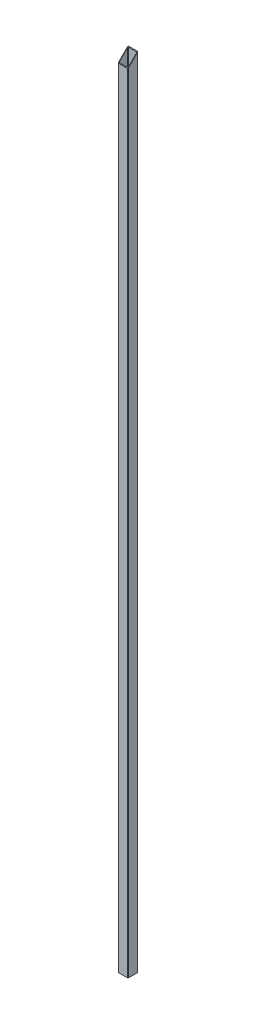
ISO-10303-21;
HEADER;
FILE_DESCRIPTION(('STEP AP214'),'2;1');
FILE_NAME('part.step','',(''),(''),'','','');
FILE_SCHEMA(('AUTOMOTIVE_DESIGN { 1 0 10303 214 1 1 1 1 }'));
ENDSEC;
DATA;
#1=APPLICATION_CONTEXT('core data for automotive mechanical design processes');
#2=APPLICATION_PROTOCOL_DEFINITION('international standard','automotive_design',2000,#1);
#3=PRODUCT_CONTEXT('',#1,'mechanical');
#4=PRODUCT('Part','Part','',(#3));
#5=PRODUCT_RELATED_PRODUCT_CATEGORY('part','',(#4));
#6=PRODUCT_DEFINITION_FORMATION('','',#4);
#7=PRODUCT_DEFINITION_CONTEXT('part definition',#1,'design');
#8=PRODUCT_DEFINITION('design','',#6,#7);
#9=PRODUCT_DEFINITION_SHAPE('','',#8);
#10=(LENGTH_UNIT() NAMED_UNIT(*) SI_UNIT(.MILLI.,.METRE.));
#11=(NAMED_UNIT(*) PLANE_ANGLE_UNIT() SI_UNIT($,.RADIAN.));
#12=(NAMED_UNIT(*) SI_UNIT($,.STERADIAN.) SOLID_ANGLE_UNIT());
#13=UNCERTAINTY_MEASURE_WITH_UNIT(LENGTH_MEASURE(1.E-05),#10,'distance_accuracy_value','');
#14=(GEOMETRIC_REPRESENTATION_CONTEXT(3) GLOBAL_UNCERTAINTY_ASSIGNED_CONTEXT((#13)) GLOBAL_UNIT_ASSIGNED_CONTEXT((#10,
#11,#12)) REPRESENTATION_CONTEXT('',''));
#15=CARTESIAN_POINT('',(0.,0.,0.));
#16=DIRECTION('',(0.,0.,1.));
#17=DIRECTION('',(1.,0.,0.));
#18=AXIS2_PLACEMENT_3D('',#15,#16,#17);
#19=CARTESIAN_POINT('',(18.,0.,18.));
#20=DIRECTION('',(0.,1.,0.));
#21=DIRECTION('',(0.,0.,1.));
#22=AXIS2_PLACEMENT_3D('',#19,#20,#21);
#23=PLANE('',#22);
#24=CARTESIAN_POINT('',(18.,0.,18.));
#25=DIRECTION('',(0.,1.,0.));
#26=DIRECTION('',(0.,0.,1.));
#27=AXIS2_PLACEMENT_3D('',#24,#25,#26);
#28=CIRCLE('',#27,2.);
#29=CARTESIAN_POINT('',(18.,0.,20.));
#30=VERTEX_POINT('',#29);
#31=CARTESIAN_POINT('',(20.,0.,18.));
#32=VERTEX_POINT('',#31);
#33=EDGE_CURVE('E196',#30,#32,#28,.T.);
#34=ORIENTED_EDGE('',*,*,#33,.F.);
#35=DIRECTION('',(1.,0.,0.));
#36=VECTOR('',#35,1.);
#37=CARTESIAN_POINT('',(-18.,0.,20.));
#38=LINE('',#37,#36);
#39=CARTESIAN_POINT('',(-18.,0.,20.));
#40=VERTEX_POINT('',#39);
#41=EDGE_CURVE('E157',#40,#30,#38,.T.);
#42=ORIENTED_EDGE('',*,*,#41,.F.);
#43=CARTESIAN_POINT('',(-18.,0.,18.));
#44=DIRECTION('',(0.,1.,0.));
#45=DIRECTION('',(0.,0.,1.));
#46=AXIS2_PLACEMENT_3D('',#43,#44,#45);
#47=CIRCLE('',#46,2.);
#48=CARTESIAN_POINT('',(-20.,0.,18.));
#49=VERTEX_POINT('',#48);
#50=EDGE_CURVE('E213',#49,#40,#47,.T.);
#51=ORIENTED_EDGE('',*,*,#50,.F.);
#52=DIRECTION('',(0.,0.,1.));
#53=VECTOR('',#52,1.);
#54=CARTESIAN_POINT('',(-20.,0.,-18.));
#55=LINE('',#54,#53);
#56=CARTESIAN_POINT('',(-20.,0.,-18.));
#57=VERTEX_POINT('',#56);
#58=EDGE_CURVE('E210',#57,#49,#55,.T.);
#59=ORIENTED_EDGE('',*,*,#58,.F.);
#60=CARTESIAN_POINT('',(-18.,0.,-18.));
#61=DIRECTION('',(0.,1.,0.));
#62=DIRECTION('',(0.,0.,1.));
#63=AXIS2_PLACEMENT_3D('',#60,#61,#62);
#64=CIRCLE('',#63,2.);
#65=CARTESIAN_POINT('',(-18.,0.,-20.));
#66=VERTEX_POINT('',#65);
#67=EDGE_CURVE('E208',#66,#57,#64,.T.);
#68=ORIENTED_EDGE('',*,*,#67,.F.);
#69=DIRECTION('',(-1.,0.,0.));
#70=VECTOR('',#69,1.);
#71=CARTESIAN_POINT('',(-18.,0.,-20.));
#72=LINE('',#71,#70);
#73=CARTESIAN_POINT('',(18.,0.,-20.));
#74=VERTEX_POINT('',#73);
#75=EDGE_CURVE('E170',#74,#66,#72,.T.);
#76=ORIENTED_EDGE('',*,*,#75,.F.);
#77=CARTESIAN_POINT('',(18.,0.,-18.));
#78=DIRECTION('',(0.,1.,0.));
#79=DIRECTION('',(0.,0.,-1.));
#80=AXIS2_PLACEMENT_3D('',#77,#78,#79);
#81=CIRCLE('',#80,2.);
#82=CARTESIAN_POINT('',(20.,0.,-18.));
#83=VERTEX_POINT('',#82);
#84=EDGE_CURVE('E197',#83,#74,#81,.T.);
#85=ORIENTED_EDGE('',*,*,#84,.F.);
#86=DIRECTION('',(0.,0.,-1.));
#87=VECTOR('',#86,1.);
#88=CARTESIAN_POINT('',(20.,0.,-18.));
#89=LINE('',#88,#87);
#90=EDGE_CURVE('E186',#32,#83,#89,.T.);
#91=ORIENTED_EDGE('',*,*,#90,.F.);
#92=EDGE_LOOP('',(#34,#42,#51,#59,#68,#76,#85,#91));
#93=FACE_BOUND('',#92,.T.);
#94=CARTESIAN_POINT('',(16.,0.,16.));
#95=DIRECTION('',(0.,1.,0.));
#96=DIRECTION('',(0.,0.,1.));
#97=AXIS2_PLACEMENT_3D('',#94,#95,#96);
#98=CIRCLE('',#97,2.);
#99=CARTESIAN_POINT('',(16.,0.,18.));
#100=VERTEX_POINT('',#99);
#101=CARTESIAN_POINT('',(18.,0.,16.));
#102=VERTEX_POINT('',#101);
#103=EDGE_CURVE('E252',#100,#102,#98,.T.);
#104=ORIENTED_EDGE('',*,*,#103,.T.);
#105=DIRECTION('',(0.,0.,-1.));
#106=VECTOR('',#105,1.);
#107=CARTESIAN_POINT('',(18.,0.,16.));
#108=LINE('',#107,#106);
#109=CARTESIAN_POINT('',(18.,0.,-16.));
#110=VERTEX_POINT('',#109);
#111=EDGE_CURVE('E255',#102,#110,#108,.T.);
#112=ORIENTED_EDGE('',*,*,#111,.T.);
#113=CARTESIAN_POINT('',(16.,0.,-16.));
#114=DIRECTION('',(0.,1.,0.));
#115=DIRECTION('',(0.,0.,1.));
#116=AXIS2_PLACEMENT_3D('',#113,#114,#115);
#117=CIRCLE('',#116,2.);
#118=CARTESIAN_POINT('',(16.,0.,-18.));
#119=VERTEX_POINT('',#118);
#120=EDGE_CURVE('E258',#110,#119,#117,.T.);
#121=ORIENTED_EDGE('',*,*,#120,.T.);
#122=DIRECTION('',(-1.,0.,0.));
#123=VECTOR('',#122,1.);
#124=CARTESIAN_POINT('',(16.,0.,-18.));
#125=LINE('',#124,#123);
#126=CARTESIAN_POINT('',(-16.,0.,-18.));
#127=VERTEX_POINT('',#126);
#128=EDGE_CURVE('E261',#119,#127,#125,.T.);
#129=ORIENTED_EDGE('',*,*,#128,.T.);
#130=CARTESIAN_POINT('',(-16.,0.,-16.));
#131=DIRECTION('',(0.,1.,0.));
#132=DIRECTION('',(0.,0.,1.));
#133=AXIS2_PLACEMENT_3D('',#130,#131,#132);
#134=CIRCLE('',#133,2.);
#135=CARTESIAN_POINT('',(-18.,0.,-16.));
#136=VERTEX_POINT('',#135);
#137=EDGE_CURVE('E264',#127,#136,#134,.T.);
#138=ORIENTED_EDGE('',*,*,#137,.T.);
#139=DIRECTION('',(0.,0.,1.));
#140=VECTOR('',#139,1.);
#141=CARTESIAN_POINT('',(-18.,0.,16.));
#142=LINE('',#141,#140);
#143=CARTESIAN_POINT('',(-18.,0.,16.));
#144=VERTEX_POINT('',#143);
#145=EDGE_CURVE('E267',#136,#144,#142,.T.);
#146=ORIENTED_EDGE('',*,*,#145,.T.);
#147=CARTESIAN_POINT('',(-16.,0.,16.));
#148=DIRECTION('',(0.,1.,0.));
#149=DIRECTION('',(0.,0.,-1.));
#150=AXIS2_PLACEMENT_3D('',#147,#148,#149);
#151=CIRCLE('',#150,2.);
#152=CARTESIAN_POINT('',(-16.,0.,18.));
#153=VERTEX_POINT('',#152);
#154=EDGE_CURVE('E270',#144,#153,#151,.T.);
#155=ORIENTED_EDGE('',*,*,#154,.T.);
#156=DIRECTION('',(1.,0.,0.));
#157=VECTOR('',#156,1.);
#158=CARTESIAN_POINT('',(16.,0.,18.));
#159=LINE('',#158,#157);
#160=EDGE_CURVE('E273',#153,#100,#159,.T.);
#161=ORIENTED_EDGE('',*,*,#160,.T.);
#162=EDGE_LOOP('',(#104,#112,#121,#129,#138,#146,#155,#161));
#163=FACE_BOUND('',#162,.T.);
#164=ADVANCED_FACE('F35',(#93,#163),#23,.F.);
#165=CARTESIAN_POINT('',(18.,3200.,18.));
#166=DIRECTION('',(0.,-1.,0.));
#167=DIRECTION('',(0.,0.,-1.));
#168=AXIS2_PLACEMENT_3D('',#165,#166,#167);
#169=CYLINDRICAL_SURFACE('',#168,2.);
#170=DIRECTION('',(0.,-1.,0.));
#171=VECTOR('',#170,1.);
#172=CARTESIAN_POINT('',(20.,3200.,18.));
#173=LINE('',#172,#171);
#174=CARTESIAN_POINT('',(20.,3162.,17.9999999999999));
#175=VERTEX_POINT('',#174);
#176=EDGE_CURVE('E43',#175,#32,#173,.T.);
#177=ORIENTED_EDGE('',*,*,#176,.F.);
#178=CARTESIAN_POINT('',(18.,3162.,18.));
#179=DIRECTION('',(0.,-0.707106781186543,-0.707106781186552));
#180=DIRECTION('',(0.,-0.707106781186552,0.707106781186543));
#181=AXIS2_PLACEMENT_3D('',#178,#179,#180);
#182=ELLIPSE('',#181,2.8284271247462,2.);
#183=CARTESIAN_POINT('',(18.,3160.,20.));
#184=VERTEX_POINT('',#183);
#185=EDGE_CURVE('E250',#175,#184,#182,.T.);
#186=ORIENTED_EDGE('',*,*,#185,.T.);
#187=DIRECTION('',(0.,-1.,0.));
#188=VECTOR('',#187,1.);
#189=CARTESIAN_POINT('',(18.,3200.,20.));
#190=LINE('',#189,#188);
#191=EDGE_CURVE('E156',#184,#30,#190,.T.);
#192=ORIENTED_EDGE('',*,*,#191,.T.);
#193=ORIENTED_EDGE('',*,*,#33,.T.);
#194=EDGE_LOOP('',(#177,#186,#192,#193));
#195=FACE_BOUND('',#194,.T.);
#196=ADVANCED_FACE('F37',(#195),#169,.T.);
#197=CARTESIAN_POINT('',(20.,3200.,-18.));
#198=DIRECTION('',(-1.,0.,0.));
#199=DIRECTION('',(0.,0.,1.));
#200=AXIS2_PLACEMENT_3D('',#197,#198,#199);
#201=PLANE('',#200);
#202=DIRECTION('',(0.,-1.,0.));
#203=VECTOR('',#202,1.);
#204=CARTESIAN_POINT('',(20.,3200.,-18.));
#205=LINE('',#204,#203);
#206=CARTESIAN_POINT('',(20.,3198.,-18.));
#207=VERTEX_POINT('',#206);
#208=EDGE_CURVE('E173',#207,#83,#205,.T.);
#209=ORIENTED_EDGE('',*,*,#208,.F.);
#210=DIRECTION('',(0.,0.707106781186552,-0.707106781186543));
#211=VECTOR('',#210,1.);
#212=CARTESIAN_POINT('',(20.,3160.,20.));
#213=LINE('',#212,#211);
#214=EDGE_CURVE('E188',#175,#207,#213,.T.);
#215=ORIENTED_EDGE('',*,*,#214,.F.);
#216=ORIENTED_EDGE('',*,*,#176,.T.);
#217=ORIENTED_EDGE('',*,*,#90,.T.);
#218=EDGE_LOOP('',(#209,#215,#216,#217));
#219=FACE_BOUND('',#218,.T.);
#220=ADVANCED_FACE('F185',(#219),#201,.F.);
#221=CARTESIAN_POINT('',(18.,3200.,-18.));
#222=DIRECTION('',(0.,-1.,0.));
#223=DIRECTION('',(0.,0.,-1.));
#224=AXIS2_PLACEMENT_3D('',#221,#222,#223);
#225=CYLINDRICAL_SURFACE('',#224,2.);
#226=DIRECTION('',(0.,-1.,0.));
#227=VECTOR('',#226,1.);
#228=CARTESIAN_POINT('',(18.,3200.,-20.));
#229=LINE('',#228,#227);
#230=CARTESIAN_POINT('',(18.,3200.,-20.));
#231=VERTEX_POINT('',#230);
#232=EDGE_CURVE('E171',#231,#74,#229,.T.);
#233=ORIENTED_EDGE('',*,*,#232,.F.);
#234=CARTESIAN_POINT('',(18.,3198.,-18.));
#235=DIRECTION('',(0.,-0.707106781186543,-0.707106781186552));
#236=DIRECTION('',(0.,-0.707106781186552,0.707106781186543));
#237=AXIS2_PLACEMENT_3D('',#234,#235,#236);
#238=ELLIPSE('',#237,2.82842712474621,2.);
#239=EDGE_CURVE('E151',#231,#207,#238,.T.);
#240=ORIENTED_EDGE('',*,*,#239,.T.);
#241=ORIENTED_EDGE('',*,*,#208,.T.);
#242=ORIENTED_EDGE('',*,*,#84,.T.);
#243=EDGE_LOOP('',(#233,#240,#241,#242));
#244=FACE_BOUND('',#243,.T.);
#245=ADVANCED_FACE('F353',(#244),#225,.T.);
#246=CARTESIAN_POINT('',(-18.,3200.,-20.));
#247=DIRECTION('',(0.,0.,1.));
#248=DIRECTION('',(1.,0.,0.));
#249=AXIS2_PLACEMENT_3D('',#246,#247,#248);
#250=PLANE('',#249);
#251=ORIENTED_EDGE('',*,*,#75,.T.);
#252=DIRECTION('',(0.,-1.,0.));
#253=VECTOR('',#252,1.);
#254=CARTESIAN_POINT('',(-18.,3200.,-20.));
#255=LINE('',#254,#253);
#256=CARTESIAN_POINT('',(-18.,3200.,-20.));
#257=VERTEX_POINT('',#256);
#258=EDGE_CURVE('E164',#257,#66,#255,.T.);
#259=ORIENTED_EDGE('',*,*,#258,.F.);
#260=DIRECTION('',(-1.,0.,0.));
#261=VECTOR('',#260,1.);
#262=CARTESIAN_POINT('',(-18.,3200.,-20.));
#263=LINE('',#262,#261);
#264=EDGE_CURVE('E145',#231,#257,#263,.T.);
#265=ORIENTED_EDGE('',*,*,#264,.F.);
#266=ORIENTED_EDGE('',*,*,#232,.T.);
#267=EDGE_LOOP('',(#251,#259,#265,#266));
#268=FACE_BOUND('',#267,.T.);
#269=ADVANCED_FACE('F168',(#268),#250,.F.);
#270=CARTESIAN_POINT('',(-18.,3200.,-18.));
#271=DIRECTION('',(0.,-1.,0.));
#272=DIRECTION('',(0.,0.,-1.));
#273=AXIS2_PLACEMENT_3D('',#270,#271,#272);
#274=CYLINDRICAL_SURFACE('',#273,2.);
#275=DIRECTION('',(0.,-1.,0.));
#276=VECTOR('',#275,1.);
#277=CARTESIAN_POINT('',(-20.,3200.,-18.));
#278=LINE('',#277,#276);
#279=CARTESIAN_POINT('',(-20.,3198.,-18.0000000000001));
#280=VERTEX_POINT('',#279);
#281=EDGE_CURVE('E166',#280,#57,#278,.T.);
#282=ORIENTED_EDGE('',*,*,#281,.F.);
#283=CARTESIAN_POINT('',(-18.,3198.,-18.));
#284=DIRECTION('',(0.,-0.707106781186543,-0.707106781186552));
#285=DIRECTION('',(0.,-0.707106781186552,0.707106781186543));
#286=AXIS2_PLACEMENT_3D('',#283,#284,#285);
#287=ELLIPSE('',#286,2.8284271247462,2.);
#288=EDGE_CURVE('E148',#280,#257,#287,.T.);
#289=ORIENTED_EDGE('',*,*,#288,.T.);
#290=ORIENTED_EDGE('',*,*,#258,.T.);
#291=ORIENTED_EDGE('',*,*,#67,.T.);
#292=EDGE_LOOP('',(#282,#289,#290,#291));
#293=FACE_BOUND('',#292,.T.);
#294=ADVANCED_FACE('F162',(#293),#274,.T.);
#295=CARTESIAN_POINT('',(-20.,3200.,-18.));
#296=DIRECTION('',(1.,0.,0.));
#297=DIRECTION('',(0.,0.,-1.));
#298=AXIS2_PLACEMENT_3D('',#295,#296,#297);
#299=PLANE('',#298);
#300=DIRECTION('',(0.,-1.,0.));
#301=VECTOR('',#300,1.);
#302=CARTESIAN_POINT('',(-20.,3200.,18.));
#303=LINE('',#302,#301);
#304=CARTESIAN_POINT('',(-20.,3162.,18.));
#305=VERTEX_POINT('',#304);
#306=EDGE_CURVE('E175',#305,#49,#303,.T.);
#307=ORIENTED_EDGE('',*,*,#306,.F.);
#308=DIRECTION('',(0.,0.707106781186552,-0.707106781186543));
#309=VECTOR('',#308,1.);
#310=CARTESIAN_POINT('',(-20.,3160.,20.));
#311=LINE('',#310,#309);
#312=EDGE_CURVE('E231',#305,#280,#311,.T.);
#313=ORIENTED_EDGE('',*,*,#312,.T.);
#314=ORIENTED_EDGE('',*,*,#281,.T.);
#315=ORIENTED_EDGE('',*,*,#58,.T.);
#316=EDGE_LOOP('',(#307,#313,#314,#315));
#317=FACE_BOUND('',#316,.T.);
#318=ADVANCED_FACE('F226',(#317),#299,.F.);
#319=CARTESIAN_POINT('',(-18.,3200.,18.));
#320=DIRECTION('',(0.,-1.,0.));
#321=DIRECTION('',(0.,0.,-1.));
#322=AXIS2_PLACEMENT_3D('',#319,#320,#321);
#323=CYLINDRICAL_SURFACE('',#322,2.);
#324=DIRECTION('',(0.,-1.,0.));
#325=VECTOR('',#324,1.);
#326=CARTESIAN_POINT('',(-18.,3200.,20.));
#327=LINE('',#326,#325);
#328=CARTESIAN_POINT('',(-18.,3160.,20.));
#329=VERTEX_POINT('',#328);
#330=EDGE_CURVE('E218',#329,#40,#327,.T.);
#331=ORIENTED_EDGE('',*,*,#330,.F.);
#332=CARTESIAN_POINT('',(-18.,3162.,18.));
#333=DIRECTION('',(0.,-0.707106781186543,-0.707106781186552));
#334=DIRECTION('',(0.,-0.707106781186552,0.707106781186543));
#335=AXIS2_PLACEMENT_3D('',#332,#333,#334);
#336=ELLIPSE('',#335,2.8284271247462,2.);
#337=EDGE_CURVE('E50',#329,#305,#336,.T.);
#338=ORIENTED_EDGE('',*,*,#337,.T.);
#339=ORIENTED_EDGE('',*,*,#306,.T.);
#340=ORIENTED_EDGE('',*,*,#50,.T.);
#341=EDGE_LOOP('',(#331,#338,#339,#340));
#342=FACE_BOUND('',#341,.T.);
#343=ADVANCED_FACE('F222',(#342),#323,.T.);
#344=CARTESIAN_POINT('',(-18.,3200.,20.));
#345=DIRECTION('',(0.,0.,-1.));
#346=DIRECTION('',(-1.,0.,0.));
#347=AXIS2_PLACEMENT_3D('',#344,#345,#346);
#348=PLANE('',#347);
#349=ORIENTED_EDGE('',*,*,#191,.F.);
#350=DIRECTION('',(1.,0.,0.));
#351=VECTOR('',#350,1.);
#352=CARTESIAN_POINT('',(-20.,3160.,20.));
#353=LINE('',#352,#351);
#354=EDGE_CURVE('E229',#329,#184,#353,.T.);
#355=ORIENTED_EDGE('',*,*,#354,.F.);
#356=ORIENTED_EDGE('',*,*,#330,.T.);
#357=ORIENTED_EDGE('',*,*,#41,.T.);
#358=EDGE_LOOP('',(#349,#355,#356,#357));
#359=FACE_BOUND('',#358,.T.);
#360=ADVANCED_FACE('F228',(#359),#348,.F.);
#361=CARTESIAN_POINT('',(16.,3200.,16.));
#362=DIRECTION('',(0.,-1.,0.));
#363=DIRECTION('',(0.,0.,-1.));
#364=AXIS2_PLACEMENT_3D('',#361,#362,#363);
#365=CYLINDRICAL_SURFACE('',#364,2.);
#366=CARTESIAN_POINT('',(16.,3164.,16.));
#367=DIRECTION('',(0.,-0.707106781186543,-0.707106781186552));
#368=DIRECTION('',(0.,-0.707106781186552,0.707106781186543));
#369=AXIS2_PLACEMENT_3D('',#366,#367,#368);
#370=ELLIPSE('',#369,2.8284271247462,2.);
#371=CARTESIAN_POINT('',(18.,3164.,16.));
#372=VERTEX_POINT('',#371);
#373=CARTESIAN_POINT('',(16.,3162.,18.));
#374=VERTEX_POINT('',#373);
#375=EDGE_CURVE('E57',#372,#374,#370,.T.);
#376=ORIENTED_EDGE('',*,*,#375,.F.);
#377=DIRECTION('',(0.,-1.,0.));
#378=VECTOR('',#377,1.);
#379=CARTESIAN_POINT('',(18.,3200.,16.));
#380=LINE('',#379,#378);
#381=EDGE_CURVE('E201',#372,#102,#380,.T.);
#382=ORIENTED_EDGE('',*,*,#381,.T.);
#383=ORIENTED_EDGE('',*,*,#103,.F.);
#384=DIRECTION('',(0.,-1.,0.));
#385=VECTOR('',#384,1.);
#386=CARTESIAN_POINT('',(16.,3200.,18.));
#387=LINE('',#386,#385);
#388=EDGE_CURVE('E276',#374,#100,#387,.T.);
#389=ORIENTED_EDGE('',*,*,#388,.F.);
#390=EDGE_LOOP('',(#376,#382,#383,#389));
#391=FACE_BOUND('',#390,.T.);
#392=ADVANCED_FACE('F304',(#391),#365,.F.);
#393=CARTESIAN_POINT('',(18.,3200.,16.));
#394=DIRECTION('',(-1.,0.,0.));
#395=DIRECTION('',(0.,0.,1.));
#396=AXIS2_PLACEMENT_3D('',#393,#394,#395);
#397=PLANE('',#396);
#398=DIRECTION('',(0.,-0.707106781186552,0.707106781186543));
#399=VECTOR('',#398,1.);
#400=CARTESIAN_POINT('',(18.,3182.,-2.00000000000022));
#401=LINE('',#400,#399);
#402=CARTESIAN_POINT('',(18.,3196.,-16.));
#403=VERTEX_POINT('',#402);
#404=EDGE_CURVE('E245',#403,#372,#401,.T.);
#405=ORIENTED_EDGE('',*,*,#404,.F.);
#406=DIRECTION('',(0.,-1.,0.));
#407=VECTOR('',#406,1.);
#408=CARTESIAN_POINT('',(18.,3200.,-16.));
#409=LINE('',#408,#407);
#410=EDGE_CURVE('E203',#403,#110,#409,.T.);
#411=ORIENTED_EDGE('',*,*,#410,.T.);
#412=ORIENTED_EDGE('',*,*,#111,.F.);
#413=ORIENTED_EDGE('',*,*,#381,.F.);
#414=EDGE_LOOP('',(#405,#411,#412,#413));
#415=FACE_BOUND('',#414,.T.);
#416=ADVANCED_FACE('F293',(#415),#397,.T.);
#417=CARTESIAN_POINT('',(16.,3200.,-16.));
#418=DIRECTION('',(0.,-1.,0.));
#419=DIRECTION('',(0.,0.,-1.));
#420=AXIS2_PLACEMENT_3D('',#417,#418,#419);
#421=CYLINDRICAL_SURFACE('',#420,2.);
#422=CARTESIAN_POINT('',(16.,3196.,-16.));
#423=DIRECTION('',(0.,-0.707106781186543,-0.707106781186552));
#424=DIRECTION('',(0.,-0.707106781186552,0.707106781186543));
#425=AXIS2_PLACEMENT_3D('',#422,#423,#424);
#426=ELLIPSE('',#425,2.8284271247462,2.);
#427=CARTESIAN_POINT('',(16.,3198.,-18.));
#428=VERTEX_POINT('',#427);
#429=EDGE_CURVE('E243',#428,#403,#426,.T.);
#430=ORIENTED_EDGE('',*,*,#429,.F.);
#431=DIRECTION('',(0.,-1.,0.));
#432=VECTOR('',#431,1.);
#433=CARTESIAN_POINT('',(16.,3200.,-18.));
#434=LINE('',#433,#432);
#435=EDGE_CURVE('E286',#428,#119,#434,.T.);
#436=ORIENTED_EDGE('',*,*,#435,.T.);
#437=ORIENTED_EDGE('',*,*,#120,.F.);
#438=ORIENTED_EDGE('',*,*,#410,.F.);
#439=EDGE_LOOP('',(#430,#436,#437,#438));
#440=FACE_BOUND('',#439,.T.);
#441=ADVANCED_FACE('F297',(#440),#421,.F.);
#442=CARTESIAN_POINT('',(16.,3200.,-18.));
#443=DIRECTION('',(0.,0.,1.));
#444=DIRECTION('',(1.,0.,0.));
#445=AXIS2_PLACEMENT_3D('',#442,#443,#444);
#446=PLANE('',#445);
#447=DIRECTION('',(1.,0.,0.));
#448=VECTOR('',#447,1.);
#449=CARTESIAN_POINT('',(16.,3198.,-18.));
#450=LINE('',#449,#448);
#451=CARTESIAN_POINT('',(-16.,3198.,-18.));
#452=VERTEX_POINT('',#451);
#453=EDGE_CURVE('E241',#452,#428,#450,.T.);
#454=ORIENTED_EDGE('',*,*,#453,.F.);
#455=DIRECTION('',(0.,-1.,0.));
#456=VECTOR('',#455,1.);
#457=CARTESIAN_POINT('',(-16.,3200.,-18.));
#458=LINE('',#457,#456);
#459=EDGE_CURVE('E284',#452,#127,#458,.T.);
#460=ORIENTED_EDGE('',*,*,#459,.T.);
#461=ORIENTED_EDGE('',*,*,#128,.F.);
#462=ORIENTED_EDGE('',*,*,#435,.F.);
#463=EDGE_LOOP('',(#454,#460,#461,#462));
#464=FACE_BOUND('',#463,.T.);
#465=ADVANCED_FACE('F325',(#464),#446,.T.);
#466=CARTESIAN_POINT('',(-16.,3200.,-16.));
#467=DIRECTION('',(0.,-1.,0.));
#468=DIRECTION('',(0.,0.,-1.));
#469=AXIS2_PLACEMENT_3D('',#466,#467,#468);
#470=CYLINDRICAL_SURFACE('',#469,2.);
#471=CARTESIAN_POINT('',(-16.,3196.,-16.));
#472=DIRECTION('',(0.,-0.707106781186543,-0.707106781186552));
#473=DIRECTION('',(0.,-0.707106781186552,0.707106781186543));
#474=AXIS2_PLACEMENT_3D('',#471,#472,#473);
#475=ELLIPSE('',#474,2.8284271247462,2.);
#476=CARTESIAN_POINT('',(-18.,3196.,-16.));
#477=VERTEX_POINT('',#476);
#478=EDGE_CURVE('E239',#477,#452,#475,.T.);
#479=ORIENTED_EDGE('',*,*,#478,.F.);
#480=DIRECTION('',(0.,-1.,0.));
#481=VECTOR('',#480,1.);
#482=CARTESIAN_POINT('',(-18.,3200.,-16.));
#483=LINE('',#482,#481);
#484=EDGE_CURVE('E282',#477,#136,#483,.T.);
#485=ORIENTED_EDGE('',*,*,#484,.T.);
#486=ORIENTED_EDGE('',*,*,#137,.F.);
#487=ORIENTED_EDGE('',*,*,#459,.F.);
#488=EDGE_LOOP('',(#479,#485,#486,#487));
#489=FACE_BOUND('',#488,.T.);
#490=ADVANCED_FACE('F322',(#489),#470,.F.);
#491=CARTESIAN_POINT('',(-18.,3200.,16.));
#492=DIRECTION('',(1.,0.,0.));
#493=DIRECTION('',(0.,0.,-1.));
#494=AXIS2_PLACEMENT_3D('',#491,#492,#493);
#495=PLANE('',#494);
#496=DIRECTION('',(0.,0.707106781186552,-0.707106781186543));
#497=VECTOR('',#496,1.);
#498=CARTESIAN_POINT('',(-18.,3182.,-2.00000000000022));
#499=LINE('',#498,#497);
#500=CARTESIAN_POINT('',(-18.,3164.,16.));
#501=VERTEX_POINT('',#500);
#502=EDGE_CURVE('E233',#501,#477,#499,.T.);
#503=ORIENTED_EDGE('',*,*,#502,.F.);
#504=DIRECTION('',(0.,-1.,0.));
#505=VECTOR('',#504,1.);
#506=CARTESIAN_POINT('',(-18.,3200.,16.));
#507=LINE('',#506,#505);
#508=EDGE_CURVE('E280',#501,#144,#507,.T.);
#509=ORIENTED_EDGE('',*,*,#508,.T.);
#510=ORIENTED_EDGE('',*,*,#145,.F.);
#511=ORIENTED_EDGE('',*,*,#484,.F.);
#512=EDGE_LOOP('',(#503,#509,#510,#511));
#513=FACE_BOUND('',#512,.T.);
#514=ADVANCED_FACE('F316',(#513),#495,.T.);
#515=CARTESIAN_POINT('',(-16.,3200.,16.));
#516=DIRECTION('',(0.,-1.,0.));
#517=DIRECTION('',(0.,0.,-1.));
#518=AXIS2_PLACEMENT_3D('',#515,#516,#517);
#519=CYLINDRICAL_SURFACE('',#518,2.);
#520=CARTESIAN_POINT('',(-16.,3164.,16.));
#521=DIRECTION('',(0.,-0.707106781186543,-0.707106781186552));
#522=DIRECTION('',(0.,-0.707106781186552,0.707106781186543));
#523=AXIS2_PLACEMENT_3D('',#520,#521,#522);
#524=ELLIPSE('',#523,2.8284271247462,2.);
#525=CARTESIAN_POINT('',(-16.,3162.,18.));
#526=VERTEX_POINT('',#525);
#527=EDGE_CURVE('E230',#526,#501,#524,.T.);
#528=ORIENTED_EDGE('',*,*,#527,.F.);
#529=DIRECTION('',(0.,-1.,0.));
#530=VECTOR('',#529,1.);
#531=CARTESIAN_POINT('',(-16.,3200.,18.));
#532=LINE('',#531,#530);
#533=EDGE_CURVE('E278',#526,#153,#532,.T.);
#534=ORIENTED_EDGE('',*,*,#533,.T.);
#535=ORIENTED_EDGE('',*,*,#154,.F.);
#536=ORIENTED_EDGE('',*,*,#508,.F.);
#537=EDGE_LOOP('',(#528,#534,#535,#536));
#538=FACE_BOUND('',#537,.T.);
#539=ADVANCED_FACE('F312',(#538),#519,.F.);
#540=CARTESIAN_POINT('',(16.,3200.,18.));
#541=DIRECTION('',(0.,0.,-1.));
#542=DIRECTION('',(-1.,0.,0.));
#543=AXIS2_PLACEMENT_3D('',#540,#541,#542);
#544=PLANE('',#543);
#545=DIRECTION('',(-1.,0.,0.));
#546=VECTOR('',#545,1.);
#547=CARTESIAN_POINT('',(16.,3162.,18.));
#548=LINE('',#547,#546);
#549=EDGE_CURVE('E11',#374,#526,#548,.T.);
#550=ORIENTED_EDGE('',*,*,#549,.F.);
#551=ORIENTED_EDGE('',*,*,#388,.T.);
#552=ORIENTED_EDGE('',*,*,#160,.F.);
#553=ORIENTED_EDGE('',*,*,#533,.F.);
#554=EDGE_LOOP('',(#550,#551,#552,#553));
#555=FACE_BOUND('',#554,.T.);
#556=ADVANCED_FACE('F306',(#555),#544,.T.);
#557=CARTESIAN_POINT('',(-20.,3160.,20.));
#558=DIRECTION('',(0.,-0.707106781186543,-0.707106781186552));
#559=DIRECTION('',(0.,0.707106781186552,-0.707106781186543));
#560=AXIS2_PLACEMENT_3D('',#557,#558,#559);
#561=PLANE('',#560);
#562=ORIENTED_EDGE('',*,*,#375,.T.);
#563=ORIENTED_EDGE('',*,*,#549,.T.);
#564=ORIENTED_EDGE('',*,*,#527,.T.);
#565=ORIENTED_EDGE('',*,*,#502,.T.);
#566=ORIENTED_EDGE('',*,*,#478,.T.);
#567=ORIENTED_EDGE('',*,*,#453,.T.);
#568=ORIENTED_EDGE('',*,*,#429,.T.);
#569=ORIENTED_EDGE('',*,*,#404,.T.);
#570=EDGE_LOOP('',(#562,#563,#564,#565,#566,#567,#568,#569));
#571=FACE_BOUND('',#570,.T.);
#572=ORIENTED_EDGE('',*,*,#214,.T.);
#573=ORIENTED_EDGE('',*,*,#239,.F.);
#574=ORIENTED_EDGE('',*,*,#264,.T.);
#575=ORIENTED_EDGE('',*,*,#288,.F.);
#576=ORIENTED_EDGE('',*,*,#312,.F.);
#577=ORIENTED_EDGE('',*,*,#337,.F.);
#578=ORIENTED_EDGE('',*,*,#354,.T.);
#579=ORIENTED_EDGE('',*,*,#185,.F.);
#580=EDGE_LOOP('',(#572,#573,#574,#575,#576,#577,#578,#579));
#581=FACE_BOUND('',#580,.T.);
#582=ADVANCED_FACE('F147',(#571,#581),#561,.F.);
#583=CLOSED_SHELL('',(#164,#196,#220,#245,#269,#294,#318,#343,#360,#392,#416,#441,#465,#490,
#514,#539,#556,#582));
#584=MANIFOLD_SOLID_BREP('B2',#583);
#585=ADVANCED_BREP_SHAPE_REPRESENTATION('',(#18,#584),#14);
#586=SHAPE_DEFINITION_REPRESENTATION(#9,#585);
ENDSEC;
END-ISO-10303-21;
